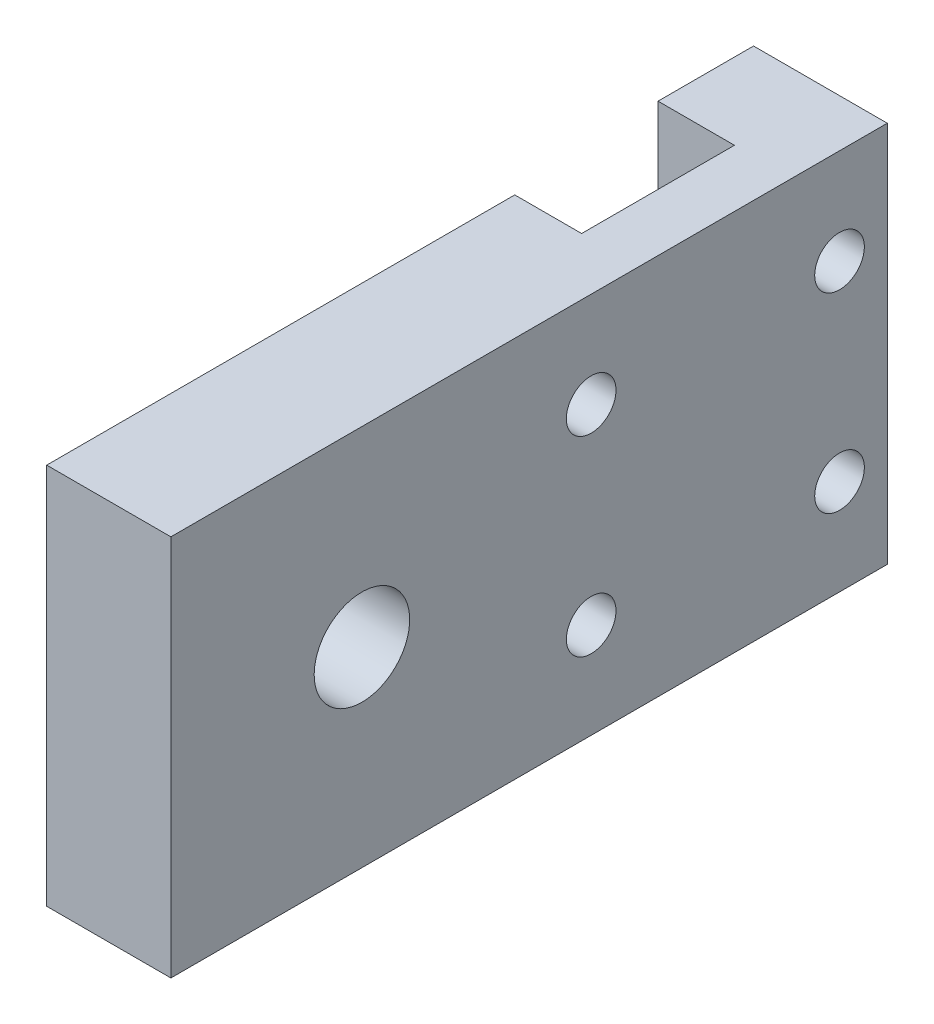
ISO-10303-21;
HEADER;
FILE_DESCRIPTION(('STEP AP214'),'2;1');
FILE_NAME('part.step','',(''),(''),'','','');
FILE_SCHEMA(('AUTOMOTIVE_DESIGN { 1 0 10303 214 1 1 1 1 }'));
ENDSEC;
DATA;
#1=APPLICATION_CONTEXT('core data for automotive mechanical design processes');
#2=APPLICATION_PROTOCOL_DEFINITION('international standard','automotive_design',2000,#1);
#3=PRODUCT_CONTEXT('',#1,'mechanical');
#4=PRODUCT('Part','Part','',(#3));
#5=PRODUCT_RELATED_PRODUCT_CATEGORY('part','',(#4));
#6=PRODUCT_DEFINITION_FORMATION('','',#4);
#7=PRODUCT_DEFINITION_CONTEXT('part definition',#1,'design');
#8=PRODUCT_DEFINITION('design','',#6,#7);
#9=PRODUCT_DEFINITION_SHAPE('','',#8);
#10=(LENGTH_UNIT() NAMED_UNIT(*) SI_UNIT(.MILLI.,.METRE.));
#11=(NAMED_UNIT(*) PLANE_ANGLE_UNIT() SI_UNIT($,.RADIAN.));
#12=(NAMED_UNIT(*) SI_UNIT($,.STERADIAN.) SOLID_ANGLE_UNIT());
#13=UNCERTAINTY_MEASURE_WITH_UNIT(LENGTH_MEASURE(1.E-05),#10,'distance_accuracy_value','');
#14=(GEOMETRIC_REPRESENTATION_CONTEXT(3) GLOBAL_UNCERTAINTY_ASSIGNED_CONTEXT((#13)) GLOBAL_UNIT_ASSIGNED_CONTEXT((#10,
#11,#12)) REPRESENTATION_CONTEXT('',''));
#15=CARTESIAN_POINT('',(0.,0.,0.));
#16=DIRECTION('',(0.,0.,1.));
#17=DIRECTION('',(1.,0.,0.));
#18=AXIS2_PLACEMENT_3D('',#15,#16,#17);
#19=CARTESIAN_POINT('',(4.,20.,-5.03571428571429));
#20=DIRECTION('',(0.,0.,-1.));
#21=DIRECTION('',(-1.,0.,0.));
#22=AXIS2_PLACEMENT_3D('',#19,#20,#21);
#23=PLANE('',#22);
#24=DIRECTION('',(1.,0.,0.));
#25=VECTOR('',#24,1.);
#26=CARTESIAN_POINT('',(4.,0.,-5.03571428571429));
#27=LINE('',#26,#25);
#28=CARTESIAN_POINT('',(0.,0.,-5.03571428571429));
#29=VERTEX_POINT('',#28);
#30=CARTESIAN_POINT('',(4.,0.,-5.03571428571429));
#31=VERTEX_POINT('',#30);
#32=EDGE_CURVE('E143',#29,#31,#27,.T.);
#33=ORIENTED_EDGE('',*,*,#32,.T.);
#34=DIRECTION('',(0.,-1.,0.));
#35=VECTOR('',#34,1.);
#36=CARTESIAN_POINT('',(4.,20.,-5.03571428571429));
#37=LINE('',#36,#35);
#38=CARTESIAN_POINT('',(4.,20.,-5.03571428571429));
#39=VERTEX_POINT('',#38);
#40=EDGE_CURVE('E11',#39,#31,#37,.T.);
#41=ORIENTED_EDGE('',*,*,#40,.F.);
#42=DIRECTION('',(1.,0.,0.));
#43=VECTOR('',#42,1.);
#44=CARTESIAN_POINT('',(4.,20.,-5.03571428571429));
#45=LINE('',#44,#43);
#46=CARTESIAN_POINT('',(0.,20.,-5.03571428571429));
#47=VERTEX_POINT('',#46);
#48=EDGE_CURVE('E165',#47,#39,#45,.T.);
#49=ORIENTED_EDGE('',*,*,#48,.F.);
#50=DIRECTION('',(0.,-1.,0.));
#51=VECTOR('',#50,1.);
#52=CARTESIAN_POINT('',(0.,20.,-5.03571428571429));
#53=LINE('',#52,#51);
#54=EDGE_CURVE('E139',#47,#29,#53,.T.);
#55=ORIENTED_EDGE('',*,*,#54,.T.);
#56=EDGE_LOOP('',(#33,#41,#49,#55));
#57=FACE_BOUND('',#56,.T.);
#58=ADVANCED_FACE('F44',(#57),#23,.F.);
#59=CARTESIAN_POINT('',(4.,20.,2.96428571428571));
#60=DIRECTION('',(1.,0.,0.));
#61=DIRECTION('',(0.,0.,-1.));
#62=AXIS2_PLACEMENT_3D('',#59,#60,#61);
#63=PLANE('',#62);
#64=DIRECTION('',(0.,0.,1.));
#65=VECTOR('',#64,1.);
#66=CARTESIAN_POINT('',(4.,0.,2.96428571428571));
#67=LINE('',#66,#65);
#68=CARTESIAN_POINT('',(4.,0.,2.96428571428571));
#69=VERTEX_POINT('',#68);
#70=EDGE_CURVE('E144',#31,#69,#67,.T.);
#71=ORIENTED_EDGE('',*,*,#70,.T.);
#72=DIRECTION('',(0.,-1.,0.));
#73=VECTOR('',#72,1.);
#74=CARTESIAN_POINT('',(4.,20.,2.96428571428571));
#75=LINE('',#74,#73);
#76=CARTESIAN_POINT('',(4.,20.,2.96428571428571));
#77=VERTEX_POINT('',#76);
#78=EDGE_CURVE('E53',#77,#69,#75,.T.);
#79=ORIENTED_EDGE('',*,*,#78,.F.);
#80=DIRECTION('',(0.,0.,1.));
#81=VECTOR('',#80,1.);
#82=CARTESIAN_POINT('',(4.,20.,2.96428571428571));
#83=LINE('',#82,#81);
#84=EDGE_CURVE('E99',#39,#77,#83,.T.);
#85=ORIENTED_EDGE('',*,*,#84,.F.);
#86=ORIENTED_EDGE('',*,*,#40,.T.);
#87=EDGE_LOOP('',(#71,#79,#85,#86));
#88=FACE_BOUND('',#87,.T.);
#89=ADVANCED_FACE('F243',(#88),#63,.F.);
#90=CARTESIAN_POINT('',(0.5,20.,2.96428571428571));
#91=DIRECTION('',(0.,0.,1.));
#92=DIRECTION('',(1.,0.,0.));
#93=AXIS2_PLACEMENT_3D('',#90,#91,#92);
#94=PLANE('',#93);
#95=DIRECTION('',(-1.,0.,0.));
#96=VECTOR('',#95,1.);
#97=CARTESIAN_POINT('',(0.5,0.,2.96428571428571));
#98=LINE('',#97,#96);
#99=CARTESIAN_POINT('',(0.5,0.,2.96428571428571));
#100=VERTEX_POINT('',#99);
#101=EDGE_CURVE('E149',#69,#100,#98,.T.);
#102=ORIENTED_EDGE('',*,*,#101,.T.);
#103=DIRECTION('',(0.,-1.,0.));
#104=VECTOR('',#103,1.);
#105=CARTESIAN_POINT('',(0.5,20.,2.96428571428571));
#106=LINE('',#105,#104);
#107=CARTESIAN_POINT('',(0.5,20.,2.96428571428571));
#108=VERTEX_POINT('',#107);
#109=EDGE_CURVE('E128',#108,#100,#106,.T.);
#110=ORIENTED_EDGE('',*,*,#109,.F.);
#111=DIRECTION('',(-1.,0.,0.));
#112=VECTOR('',#111,1.);
#113=CARTESIAN_POINT('',(0.5,20.,2.96428571428571));
#114=LINE('',#113,#112);
#115=EDGE_CURVE('E178',#77,#108,#114,.T.);
#116=ORIENTED_EDGE('',*,*,#115,.F.);
#117=ORIENTED_EDGE('',*,*,#78,.T.);
#118=EDGE_LOOP('',(#102,#110,#116,#117));
#119=FACE_BOUND('',#118,.T.);
#120=ADVANCED_FACE('F173',(#119),#94,.F.);
#121=CARTESIAN_POINT('',(0.5,20.,5.96428571428571));
#122=DIRECTION('',(1.,0.,0.));
#123=DIRECTION('',(0.,0.,-1.));
#124=AXIS2_PLACEMENT_3D('',#121,#122,#123);
#125=PLANE('',#124);
#126=CARTESIAN_POINT('',(0.500000000000002,10.,17.4642857142857));
#127=DIRECTION('',(-1.,0.,0.));
#128=DIRECTION('',(0.,0.,1.));
#129=AXIS2_PLACEMENT_3D('',#126,#127,#128);
#130=CIRCLE('',#129,2.5);
#131=CARTESIAN_POINT('',(0.500000000000002,10.,19.9642857142857));
#132=VERTEX_POINT('',#131);
#133=EDGE_CURVE('E301',#132,#132,#130,.T.);
#134=ORIENTED_EDGE('',*,*,#133,.F.);
#135=EDGE_LOOP('',(#134));
#136=FACE_BOUND('',#135,.T.);
#137=CARTESIAN_POINT('',(0.5,15.,5.46428571428571));
#138=DIRECTION('',(-1.,0.,0.));
#139=DIRECTION('',(0.,0.,1.));
#140=AXIS2_PLACEMENT_3D('',#137,#138,#139);
#141=CIRCLE('',#140,1.3);
#142=CARTESIAN_POINT('',(0.5,15.,6.76428571428571));
#143=VERTEX_POINT('',#142);
#144=EDGE_CURVE('E314',#143,#143,#141,.T.);
#145=ORIENTED_EDGE('',*,*,#144,.F.);
#146=EDGE_LOOP('',(#145));
#147=FACE_BOUND('',#146,.T.);
#148=CARTESIAN_POINT('',(0.5,5.,5.46428571428571));
#149=DIRECTION('',(-1.,0.,0.));
#150=DIRECTION('',(0.,0.,-1.));
#151=AXIS2_PLACEMENT_3D('',#148,#149,#150);
#152=CIRCLE('',#151,1.3);
#153=CARTESIAN_POINT('',(0.5,5.,4.16428571428571));
#154=VERTEX_POINT('',#153);
#155=EDGE_CURVE('E309',#154,#154,#152,.T.);
#156=ORIENTED_EDGE('',*,*,#155,.F.);
#157=EDGE_LOOP('',(#156));
#158=FACE_BOUND('',#157,.T.);
#159=DIRECTION('',(0.,0.,1.));
#160=VECTOR('',#159,1.);
#161=CARTESIAN_POINT('',(0.5,0.,5.96428571428571));
#162=LINE('',#161,#160);
#163=CARTESIAN_POINT('',(0.5,0.,27.4642857142857));
#164=VERTEX_POINT('',#163);
#165=EDGE_CURVE('E155',#100,#164,#162,.T.);
#166=ORIENTED_EDGE('',*,*,#165,.T.);
#167=DIRECTION('',(0.,1.,0.));
#168=VECTOR('',#167,1.);
#169=CARTESIAN_POINT('',(0.5,0.,27.4642857142857));
#170=LINE('',#169,#168);
#171=CARTESIAN_POINT('',(0.5,20.,27.4642857142857));
#172=VERTEX_POINT('',#171);
#173=EDGE_CURVE('E193',#164,#172,#170,.T.);
#174=ORIENTED_EDGE('',*,*,#173,.T.);
#175=DIRECTION('',(0.,0.,1.));
#176=VECTOR('',#175,1.);
#177=CARTESIAN_POINT('',(0.5,20.,5.96428571428571));
#178=LINE('',#177,#176);
#179=EDGE_CURVE('E122',#108,#172,#178,.T.);
#180=ORIENTED_EDGE('',*,*,#179,.F.);
#181=ORIENTED_EDGE('',*,*,#109,.T.);
#182=EDGE_LOOP('',(#166,#174,#180,#181));
#183=FACE_BOUND('',#182,.T.);
#184=ADVANCED_FACE('F187',(#136,#147,#158,#183),#125,.F.);
#185=CARTESIAN_POINT('',(7.,20.,-10.0357142857143));
#186=DIRECTION('',(-1.,0.,0.));
#187=DIRECTION('',(0.,0.,1.));
#188=AXIS2_PLACEMENT_3D('',#185,#186,#187);
#189=PLANE('',#188);
#190=CARTESIAN_POINT('',(7.,10.,17.4642857142857));
#191=DIRECTION('',(-1.,0.,0.));
#192=DIRECTION('',(0.,0.,1.));
#193=AXIS2_PLACEMENT_3D('',#190,#191,#192);
#194=CIRCLE('',#193,2.5);
#195=CARTESIAN_POINT('',(7.,10.,19.9642857142857));
#196=VERTEX_POINT('',#195);
#197=EDGE_CURVE('E262',#196,#196,#194,.F.);
#198=ORIENTED_EDGE('',*,*,#197,.F.);
#199=EDGE_LOOP('',(#198));
#200=FACE_BOUND('',#199,.T.);
#201=CARTESIAN_POINT('',(7.,15.,5.46428571428571));
#202=DIRECTION('',(-1.,0.,0.));
#203=DIRECTION('',(0.,0.,1.));
#204=AXIS2_PLACEMENT_3D('',#201,#202,#203);
#205=CIRCLE('',#204,1.3);
#206=CARTESIAN_POINT('',(7.,15.,6.76428571428571));
#207=VERTEX_POINT('',#206);
#208=EDGE_CURVE('E268',#207,#207,#205,.F.);
#209=ORIENTED_EDGE('',*,*,#208,.F.);
#210=EDGE_LOOP('',(#209));
#211=FACE_BOUND('',#210,.T.);
#212=CARTESIAN_POINT('',(7.,5.,5.46428571428571));
#213=DIRECTION('',(-1.,0.,0.));
#214=DIRECTION('',(0.,0.,1.));
#215=AXIS2_PLACEMENT_3D('',#212,#213,#214);
#216=CIRCLE('',#215,1.3);
#217=CARTESIAN_POINT('',(7.,5.,6.76428571428571));
#218=VERTEX_POINT('',#217);
#219=EDGE_CURVE('E275',#218,#218,#216,.F.);
#220=ORIENTED_EDGE('',*,*,#219,.F.);
#221=EDGE_LOOP('',(#220));
#222=FACE_BOUND('',#221,.T.);
#223=CARTESIAN_POINT('',(7.,15.,-7.53571428571429));
#224=DIRECTION('',(-1.,0.,0.));
#225=DIRECTION('',(0.,0.,1.));
#226=AXIS2_PLACEMENT_3D('',#223,#224,#225);
#227=CIRCLE('',#226,1.3);
#228=CARTESIAN_POINT('',(7.,15.,-6.23571428571429));
#229=VERTEX_POINT('',#228);
#230=EDGE_CURVE('E148',#229,#229,#227,.F.);
#231=ORIENTED_EDGE('',*,*,#230,.F.);
#232=EDGE_LOOP('',(#231));
#233=FACE_BOUND('',#232,.T.);
#234=CARTESIAN_POINT('',(7.,5.,-7.53571428571429));
#235=DIRECTION('',(-1.,0.,0.));
#236=DIRECTION('',(0.,0.,1.));
#237=AXIS2_PLACEMENT_3D('',#234,#235,#236);
#238=CIRCLE('',#237,1.3);
#239=CARTESIAN_POINT('',(7.,5.,-6.23571428571429));
#240=VERTEX_POINT('',#239);
#241=EDGE_CURVE('E199',#240,#240,#238,.F.);
#242=ORIENTED_EDGE('',*,*,#241,.F.);
#243=EDGE_LOOP('',(#242));
#244=FACE_BOUND('',#243,.T.);
#245=DIRECTION('',(0.,0.,-1.));
#246=VECTOR('',#245,1.);
#247=CARTESIAN_POINT('',(7.,0.,-10.0357142857143));
#248=LINE('',#247,#246);
#249=CARTESIAN_POINT('',(7.,0.,27.4642857142857));
#250=VERTEX_POINT('',#249);
#251=CARTESIAN_POINT('',(7.,0.,-10.0357142857143));
#252=VERTEX_POINT('',#251);
#253=EDGE_CURVE('E126',#250,#252,#248,.T.);
#254=ORIENTED_EDGE('',*,*,#253,.T.);
#255=DIRECTION('',(0.,-1.,0.));
#256=VECTOR('',#255,1.);
#257=CARTESIAN_POINT('',(7.,20.,-10.0357142857143));
#258=LINE('',#257,#256);
#259=CARTESIAN_POINT('',(7.,20.,-10.0357142857143));
#260=VERTEX_POINT('',#259);
#261=EDGE_CURVE('E121',#260,#252,#258,.T.);
#262=ORIENTED_EDGE('',*,*,#261,.F.);
#263=DIRECTION('',(0.,0.,-1.));
#264=VECTOR('',#263,1.);
#265=CARTESIAN_POINT('',(7.,20.,-10.0357142857143));
#266=LINE('',#265,#264);
#267=CARTESIAN_POINT('',(7.,20.,27.4642857142857));
#268=VERTEX_POINT('',#267);
#269=EDGE_CURVE('E112',#268,#260,#266,.T.);
#270=ORIENTED_EDGE('',*,*,#269,.F.);
#271=DIRECTION('',(0.,1.,0.));
#272=VECTOR('',#271,1.);
#273=CARTESIAN_POINT('',(7.,0.,27.4642857142857));
#274=LINE('',#273,#272);
#275=EDGE_CURVE('E198',#250,#268,#274,.T.);
#276=ORIENTED_EDGE('',*,*,#275,.F.);
#277=EDGE_LOOP('',(#254,#262,#270,#276));
#278=FACE_BOUND('',#277,.T.);
#279=ADVANCED_FACE('F127',(#200,#211,#222,#233,#244,#278),#189,.F.);
#280=CARTESIAN_POINT('',(0.,20.,-10.0357142857143));
#281=DIRECTION('',(0.,0.,1.));
#282=DIRECTION('',(1.,0.,0.));
#283=AXIS2_PLACEMENT_3D('',#280,#281,#282);
#284=PLANE('',#283);
#285=DIRECTION('',(-1.,0.,0.));
#286=VECTOR('',#285,1.);
#287=CARTESIAN_POINT('',(0.,0.,-10.0357142857143));
#288=LINE('',#287,#286);
#289=CARTESIAN_POINT('',(0.,0.,-10.0357142857143));
#290=VERTEX_POINT('',#289);
#291=EDGE_CURVE('E88',#252,#290,#288,.T.);
#292=ORIENTED_EDGE('',*,*,#291,.T.);
#293=DIRECTION('',(0.,-1.,0.));
#294=VECTOR('',#293,1.);
#295=CARTESIAN_POINT('',(0.,20.,-10.0357142857143));
#296=LINE('',#295,#294);
#297=CARTESIAN_POINT('',(0.,20.,-10.0357142857143));
#298=VERTEX_POINT('',#297);
#299=EDGE_CURVE('E131',#298,#290,#296,.T.);
#300=ORIENTED_EDGE('',*,*,#299,.F.);
#301=DIRECTION('',(-1.,0.,0.));
#302=VECTOR('',#301,1.);
#303=CARTESIAN_POINT('',(0.,20.,-10.0357142857143));
#304=LINE('',#303,#302);
#305=EDGE_CURVE('E113',#260,#298,#304,.T.);
#306=ORIENTED_EDGE('',*,*,#305,.F.);
#307=ORIENTED_EDGE('',*,*,#261,.T.);
#308=EDGE_LOOP('',(#292,#300,#306,#307));
#309=FACE_BOUND('',#308,.T.);
#310=ADVANCED_FACE('F132',(#309),#284,.F.);
#311=CARTESIAN_POINT('',(0.,20.,-5.03571428571429));
#312=DIRECTION('',(1.,0.,0.));
#313=DIRECTION('',(0.,0.,-1.));
#314=AXIS2_PLACEMENT_3D('',#311,#312,#313);
#315=PLANE('',#314);
#316=CARTESIAN_POINT('',(0.,15.,-7.53571428571429));
#317=DIRECTION('',(-1.,0.,0.));
#318=DIRECTION('',(0.,0.,1.));
#319=AXIS2_PLACEMENT_3D('',#316,#317,#318);
#320=CIRCLE('',#319,1.3);
#321=CARTESIAN_POINT('',(0.,15.,-6.23571428571429));
#322=VERTEX_POINT('',#321);
#323=EDGE_CURVE('E202',#322,#322,#320,.T.);
#324=ORIENTED_EDGE('',*,*,#323,.F.);
#325=EDGE_LOOP('',(#324));
#326=FACE_BOUND('',#325,.T.);
#327=CARTESIAN_POINT('',(0.,5.,-7.53571428571429));
#328=DIRECTION('',(-1.,0.,0.));
#329=DIRECTION('',(0.,0.,-1.));
#330=AXIS2_PLACEMENT_3D('',#327,#328,#329);
#331=CIRCLE('',#330,1.3);
#332=CARTESIAN_POINT('',(0.,5.,-8.83571428571429));
#333=VERTEX_POINT('',#332);
#334=EDGE_CURVE('E207',#333,#333,#331,.T.);
#335=ORIENTED_EDGE('',*,*,#334,.F.);
#336=EDGE_LOOP('',(#335));
#337=FACE_BOUND('',#336,.T.);
#338=DIRECTION('',(0.,0.,1.));
#339=VECTOR('',#338,1.);
#340=CARTESIAN_POINT('',(0.,0.,-5.03571428571429));
#341=LINE('',#340,#339);
#342=EDGE_CURVE('E95',#290,#29,#341,.T.);
#343=ORIENTED_EDGE('',*,*,#342,.T.);
#344=ORIENTED_EDGE('',*,*,#54,.F.);
#345=DIRECTION('',(0.,0.,1.));
#346=VECTOR('',#345,1.);
#347=CARTESIAN_POINT('',(0.,20.,-5.03571428571429));
#348=LINE('',#347,#346);
#349=EDGE_CURVE('E65',#298,#47,#348,.T.);
#350=ORIENTED_EDGE('',*,*,#349,.F.);
#351=ORIENTED_EDGE('',*,*,#299,.T.);
#352=EDGE_LOOP('',(#343,#344,#350,#351));
#353=FACE_BOUND('',#352,.T.);
#354=ADVANCED_FACE('F228',(#326,#337,#353),#315,.F.);
#355=CARTESIAN_POINT('',(0.,20.,0.));
#356=DIRECTION('',(0.,-1.,0.));
#357=DIRECTION('',(0.,0.,-1.));
#358=AXIS2_PLACEMENT_3D('',#355,#356,#357);
#359=PLANE('',#358);
#360=ORIENTED_EDGE('',*,*,#48,.T.);
#361=ORIENTED_EDGE('',*,*,#84,.T.);
#362=ORIENTED_EDGE('',*,*,#115,.T.);
#363=ORIENTED_EDGE('',*,*,#179,.T.);
#364=DIRECTION('',(1.,0.,0.));
#365=VECTOR('',#364,1.);
#366=CARTESIAN_POINT('',(7.,20.,27.4642857142857));
#367=LINE('',#366,#365);
#368=EDGE_CURVE('E117',#172,#268,#367,.T.);
#369=ORIENTED_EDGE('',*,*,#368,.T.);
#370=ORIENTED_EDGE('',*,*,#269,.T.);
#371=ORIENTED_EDGE('',*,*,#305,.T.);
#372=ORIENTED_EDGE('',*,*,#349,.T.);
#373=EDGE_LOOP('',(#360,#361,#362,#363,#369,#370,#371,#372));
#374=FACE_BOUND('',#373,.T.);
#375=ADVANCED_FACE('F114',(#374),#359,.F.);
#376=CARTESIAN_POINT('',(0.,0.,0.));
#377=DIRECTION('',(0.,-1.,0.));
#378=DIRECTION('',(0.,0.,-1.));
#379=AXIS2_PLACEMENT_3D('',#376,#377,#378);
#380=PLANE('',#379);
#381=ORIENTED_EDGE('',*,*,#32,.F.);
#382=ORIENTED_EDGE('',*,*,#342,.F.);
#383=ORIENTED_EDGE('',*,*,#291,.F.);
#384=ORIENTED_EDGE('',*,*,#253,.F.);
#385=DIRECTION('',(1.,0.,0.));
#386=VECTOR('',#385,1.);
#387=CARTESIAN_POINT('',(7.,0.,27.4642857142857));
#388=LINE('',#387,#386);
#389=EDGE_CURVE('E184',#164,#250,#388,.T.);
#390=ORIENTED_EDGE('',*,*,#389,.F.);
#391=ORIENTED_EDGE('',*,*,#165,.F.);
#392=ORIENTED_EDGE('',*,*,#101,.F.);
#393=ORIENTED_EDGE('',*,*,#70,.F.);
#394=EDGE_LOOP('',(#381,#382,#383,#384,#390,#391,#392,#393));
#395=FACE_BOUND('',#394,.T.);
#396=ADVANCED_FACE('F176',(#395),#380,.T.);
#397=CARTESIAN_POINT('',(7.001,5.,-7.53571428571429));
#398=DIRECTION('',(-1.,0.,0.));
#399=DIRECTION('',(0.,0.,1.));
#400=AXIS2_PLACEMENT_3D('',#397,#398,#399);
#401=CYLINDRICAL_SURFACE('',#400,1.3);
#402=ORIENTED_EDGE('',*,*,#334,.T.);
#403=EDGE_LOOP('',(#402));
#404=FACE_BOUND('',#403,.T.);
#405=ORIENTED_EDGE('',*,*,#241,.T.);
#406=EDGE_LOOP('',(#405));
#407=FACE_BOUND('',#406,.T.);
#408=ADVANCED_FACE('F280',(#404,#407),#401,.F.);
#409=CARTESIAN_POINT('',(7.001,15.,-7.53571428571429));
#410=DIRECTION('',(-1.,0.,0.));
#411=DIRECTION('',(0.,0.,1.));
#412=AXIS2_PLACEMENT_3D('',#409,#410,#411);
#413=CYLINDRICAL_SURFACE('',#412,1.3);
#414=ORIENTED_EDGE('',*,*,#323,.T.);
#415=EDGE_LOOP('',(#414));
#416=FACE_BOUND('',#415,.T.);
#417=ORIENTED_EDGE('',*,*,#230,.T.);
#418=EDGE_LOOP('',(#417));
#419=FACE_BOUND('',#418,.T.);
#420=ADVANCED_FACE('F279',(#416,#419),#413,.F.);
#421=CARTESIAN_POINT('',(7.,0.,27.4642857142857));
#422=DIRECTION('',(0.,0.,1.));
#423=DIRECTION('',(1.,0.,0.));
#424=AXIS2_PLACEMENT_3D('',#421,#422,#423);
#425=PLANE('',#424);
#426=ORIENTED_EDGE('',*,*,#368,.F.);
#427=ORIENTED_EDGE('',*,*,#173,.F.);
#428=ORIENTED_EDGE('',*,*,#389,.T.);
#429=ORIENTED_EDGE('',*,*,#275,.T.);
#430=EDGE_LOOP('',(#426,#427,#428,#429));
#431=FACE_BOUND('',#430,.T.);
#432=ADVANCED_FACE('F195',(#431),#425,.T.);
#433=CARTESIAN_POINT('',(7.001,5.,5.46428571428571));
#434=DIRECTION('',(-1.,0.,0.));
#435=DIRECTION('',(0.,0.,1.));
#436=AXIS2_PLACEMENT_3D('',#433,#434,#435);
#437=CYLINDRICAL_SURFACE('',#436,1.3);
#438=ORIENTED_EDGE('',*,*,#155,.T.);
#439=EDGE_LOOP('',(#438));
#440=FACE_BOUND('',#439,.T.);
#441=ORIENTED_EDGE('',*,*,#219,.T.);
#442=EDGE_LOOP('',(#441));
#443=FACE_BOUND('',#442,.T.);
#444=ADVANCED_FACE('F286',(#440,#443),#437,.F.);
#445=CARTESIAN_POINT('',(7.001,15.,5.46428571428571));
#446=DIRECTION('',(-1.,0.,0.));
#447=DIRECTION('',(0.,0.,1.));
#448=AXIS2_PLACEMENT_3D('',#445,#446,#447);
#449=CYLINDRICAL_SURFACE('',#448,1.3);
#450=ORIENTED_EDGE('',*,*,#144,.T.);
#451=EDGE_LOOP('',(#450));
#452=FACE_BOUND('',#451,.T.);
#453=ORIENTED_EDGE('',*,*,#208,.T.);
#454=EDGE_LOOP('',(#453));
#455=FACE_BOUND('',#454,.T.);
#456=ADVANCED_FACE('F291',(#452,#455),#449,.F.);
#457=CARTESIAN_POINT('',(7.001,10.,17.4642857142857));
#458=DIRECTION('',(-1.,0.,0.));
#459=DIRECTION('',(0.,0.,1.));
#460=AXIS2_PLACEMENT_3D('',#457,#458,#459);
#461=CYLINDRICAL_SURFACE('',#460,2.5);
#462=ORIENTED_EDGE('',*,*,#133,.T.);
#463=EDGE_LOOP('',(#462));
#464=FACE_BOUND('',#463,.T.);
#465=ORIENTED_EDGE('',*,*,#197,.T.);
#466=EDGE_LOOP('',(#465));
#467=FACE_BOUND('',#466,.T.);
#468=ADVANCED_FACE('F300',(#464,#467),#461,.F.);
#469=CLOSED_SHELL('',(#58,#89,#120,#184,#279,#310,#354,#375,#396,#408,#420,#432,#444,#456,#468));
#470=MANIFOLD_SOLID_BREP('B2',#469);
#471=ADVANCED_BREP_SHAPE_REPRESENTATION('',(#18,#470),#14);
#472=SHAPE_DEFINITION_REPRESENTATION(#9,#471);
ENDSEC;
END-ISO-10303-21;
